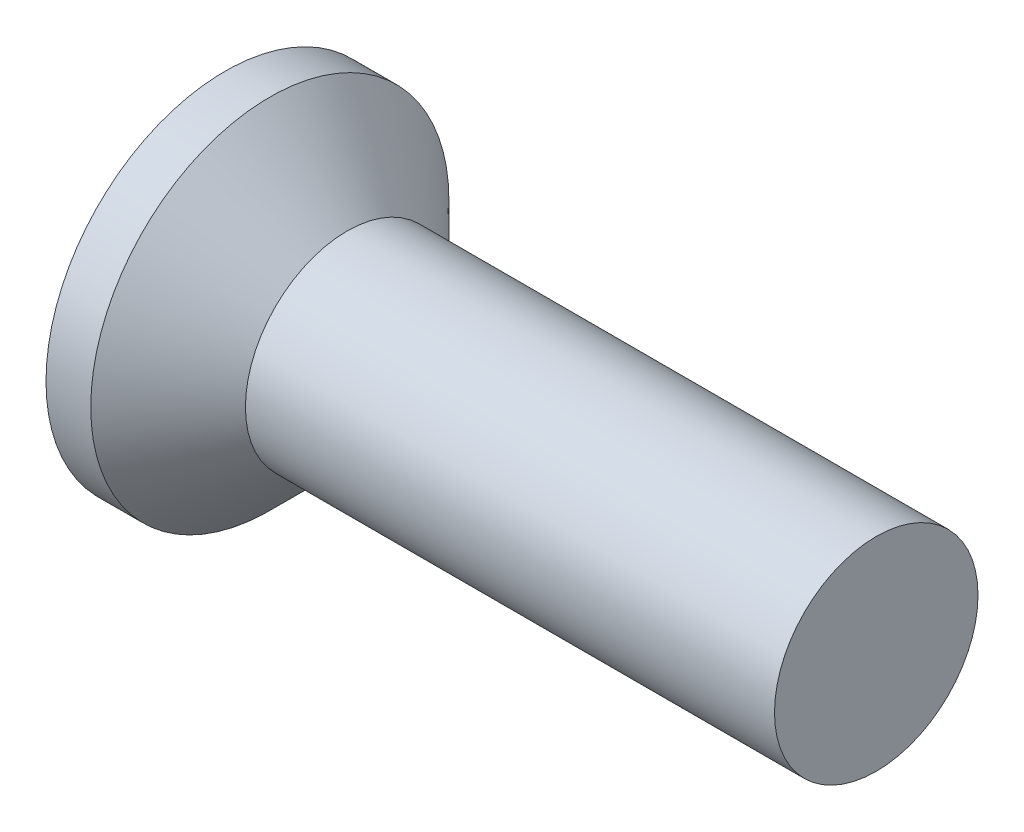
ISO-10303-21;
HEADER;
FILE_DESCRIPTION(('STEP AP214'),'2;1');
FILE_NAME('part.step','',(''),(''),'','','');
FILE_SCHEMA(('AUTOMOTIVE_DESIGN { 1 0 10303 214 1 1 1 1 }'));
ENDSEC;
DATA;
#1=APPLICATION_CONTEXT('core data for automotive mechanical design processes');
#2=APPLICATION_PROTOCOL_DEFINITION('international standard','automotive_design',2000,#1);
#3=PRODUCT_CONTEXT('',#1,'mechanical');
#4=PRODUCT('Part','Part','',(#3));
#5=PRODUCT_RELATED_PRODUCT_CATEGORY('part','',(#4));
#6=PRODUCT_DEFINITION_FORMATION('','',#4);
#7=PRODUCT_DEFINITION_CONTEXT('part definition',#1,'design');
#8=PRODUCT_DEFINITION('design','',#6,#7);
#9=PRODUCT_DEFINITION_SHAPE('','',#8);
#10=(LENGTH_UNIT() NAMED_UNIT(*) SI_UNIT(.MILLI.,.METRE.));
#11=(NAMED_UNIT(*) PLANE_ANGLE_UNIT() SI_UNIT($,.RADIAN.));
#12=(NAMED_UNIT(*) SI_UNIT($,.STERADIAN.) SOLID_ANGLE_UNIT());
#13=UNCERTAINTY_MEASURE_WITH_UNIT(LENGTH_MEASURE(1.E-05),#10,'distance_accuracy_value','');
#14=(GEOMETRIC_REPRESENTATION_CONTEXT(3) GLOBAL_UNCERTAINTY_ASSIGNED_CONTEXT((#13)) GLOBAL_UNIT_ASSIGNED_CONTEXT((#10,
#11,#12)) REPRESENTATION_CONTEXT('',''));
#15=CARTESIAN_POINT('',(0.,0.,0.));
#16=DIRECTION('',(0.,0.,1.));
#17=DIRECTION('',(1.,0.,0.));
#18=AXIS2_PLACEMENT_3D('',#15,#16,#17);
#19=CARTESIAN_POINT('',(0.,2.2,0.));
#20=DIRECTION('',(-1.,0.,0.));
#21=DIRECTION('',(0.,0.,1.));
#22=AXIS2_PLACEMENT_3D('',#19,#20,#21);
#23=PLANE('',#22);
#24=CARTESIAN_POINT('',(0.,0.,0.));
#25=DIRECTION('',(1.,0.,0.));
#26=DIRECTION('',(0.,0.,-1.));
#27=AXIS2_PLACEMENT_3D('',#24,#25,#26);
#28=CIRCLE('',#27,2.2);
#29=CARTESIAN_POINT('',(0.,0.,-2.2));
#30=VERTEX_POINT('',#29);
#31=EDGE_CURVE('E182',#30,#30,#28,.T.);
#32=ORIENTED_EDGE('',*,*,#31,.F.);
#33=EDGE_LOOP('',(#32));
#34=FACE_BOUND('',#33,.T.);
#35=DIRECTION('',(0.,1.,0.));
#36=VECTOR('',#35,1.);
#37=CARTESIAN_POINT('',(0.,-0.29,-0.29));
#38=LINE('',#37,#36);
#39=CARTESIAN_POINT('',(0.,-1.45,-0.29));
#40=VERTEX_POINT('',#39);
#41=CARTESIAN_POINT('',(0.,-0.59,-0.29));
#42=VERTEX_POINT('',#41);
#43=EDGE_CURVE('E308',#40,#42,#38,.T.);
#44=ORIENTED_EDGE('',*,*,#43,.T.);
#45=CARTESIAN_POINT('',(0.,-0.59,-0.59));
#46=DIRECTION('',(-1.,0.,0.));
#47=DIRECTION('',(0.,0.,1.));
#48=AXIS2_PLACEMENT_3D('',#45,#46,#47);
#49=CIRCLE('',#48,0.3);
#50=CARTESIAN_POINT('',(0.,-0.29,-0.59));
#51=VERTEX_POINT('',#50);
#52=EDGE_CURVE('E187',#42,#51,#49,.T.);
#53=ORIENTED_EDGE('',*,*,#52,.T.);
#54=DIRECTION('',(0.,0.,-1.));
#55=VECTOR('',#54,1.);
#56=CARTESIAN_POINT('',(0.,-0.29,-0.29));
#57=LINE('',#56,#55);
#58=CARTESIAN_POINT('',(0.,-0.29,-1.45));
#59=VERTEX_POINT('',#58);
#60=EDGE_CURVE('E310',#51,#59,#57,.T.);
#61=ORIENTED_EDGE('',*,*,#60,.T.);
#62=DIRECTION('',(0.,1.,0.));
#63=VECTOR('',#62,1.);
#64=CARTESIAN_POINT('',(0.,0.29,-1.45));
#65=LINE('',#64,#63);
#66=CARTESIAN_POINT('',(0.,0.29,-1.45));
#67=VERTEX_POINT('',#66);
#68=EDGE_CURVE('E312',#59,#67,#65,.T.);
#69=ORIENTED_EDGE('',*,*,#68,.T.);
#70=DIRECTION('',(0.,0.,1.));
#71=VECTOR('',#70,1.);
#72=CARTESIAN_POINT('',(0.,0.29,-0.29));
#73=LINE('',#72,#71);
#74=CARTESIAN_POINT('',(0.,0.29,-0.59));
#75=VERTEX_POINT('',#74);
#76=EDGE_CURVE('E315',#67,#75,#73,.T.);
#77=ORIENTED_EDGE('',*,*,#76,.T.);
#78=CARTESIAN_POINT('',(0.,0.59,-0.59));
#79=DIRECTION('',(-1.,0.,0.));
#80=DIRECTION('',(0.,0.,1.));
#81=AXIS2_PLACEMENT_3D('',#78,#79,#80);
#82=CIRCLE('',#81,0.3);
#83=CARTESIAN_POINT('',(0.,0.59,-0.29));
#84=VERTEX_POINT('',#83);
#85=EDGE_CURVE('E185',#75,#84,#82,.T.);
#86=ORIENTED_EDGE('',*,*,#85,.T.);
#87=DIRECTION('',(0.,1.,0.));
#88=VECTOR('',#87,1.);
#89=CARTESIAN_POINT('',(0.,0.29,-0.29));
#90=LINE('',#89,#88);
#91=CARTESIAN_POINT('',(0.,1.45,-0.29));
#92=VERTEX_POINT('',#91);
#93=EDGE_CURVE('E318',#84,#92,#90,.T.);
#94=ORIENTED_EDGE('',*,*,#93,.T.);
#95=DIRECTION('',(0.,0.,1.));
#96=VECTOR('',#95,1.);
#97=CARTESIAN_POINT('',(0.,1.45,-0.29));
#98=LINE('',#97,#96);
#99=CARTESIAN_POINT('',(0.,1.45,0.29));
#100=VERTEX_POINT('',#99);
#101=EDGE_CURVE('E320',#92,#100,#98,.T.);
#102=ORIENTED_EDGE('',*,*,#101,.T.);
#103=DIRECTION('',(0.,-1.,0.));
#104=VECTOR('',#103,1.);
#105=CARTESIAN_POINT('',(0.,0.29,0.29));
#106=LINE('',#105,#104);
#107=CARTESIAN_POINT('',(0.,0.59,0.29));
#108=VERTEX_POINT('',#107);
#109=EDGE_CURVE('E323',#100,#108,#106,.T.);
#110=ORIENTED_EDGE('',*,*,#109,.T.);
#111=CARTESIAN_POINT('',(0.,0.59,0.59));
#112=DIRECTION('',(-1.,0.,0.));
#113=DIRECTION('',(0.,0.,1.));
#114=AXIS2_PLACEMENT_3D('',#111,#112,#113);
#115=CIRCLE('',#114,0.3);
#116=CARTESIAN_POINT('',(0.,0.29,0.59));
#117=VERTEX_POINT('',#116);
#118=EDGE_CURVE('E150',#108,#117,#115,.T.);
#119=ORIENTED_EDGE('',*,*,#118,.T.);
#120=DIRECTION('',(0.,0.,1.));
#121=VECTOR('',#120,1.);
#122=CARTESIAN_POINT('',(0.,0.29,0.29));
#123=LINE('',#122,#121);
#124=CARTESIAN_POINT('',(0.,0.29,1.45));
#125=VERTEX_POINT('',#124);
#126=EDGE_CURVE('E144',#117,#125,#123,.T.);
#127=ORIENTED_EDGE('',*,*,#126,.T.);
#128=DIRECTION('',(0.,-1.,0.));
#129=VECTOR('',#128,1.);
#130=CARTESIAN_POINT('',(0.,0.29,1.45));
#131=LINE('',#130,#129);
#132=CARTESIAN_POINT('',(0.,-0.29,1.45));
#133=VERTEX_POINT('',#132);
#134=EDGE_CURVE('E148',#125,#133,#131,.T.);
#135=ORIENTED_EDGE('',*,*,#134,.T.);
#136=DIRECTION('',(0.,0.,-1.));
#137=VECTOR('',#136,1.);
#138=CARTESIAN_POINT('',(0.,-0.29,0.29));
#139=LINE('',#138,#137);
#140=CARTESIAN_POINT('',(0.,-0.29,0.59));
#141=VERTEX_POINT('',#140);
#142=EDGE_CURVE('E162',#133,#141,#139,.T.);
#143=ORIENTED_EDGE('',*,*,#142,.T.);
#144=CARTESIAN_POINT('',(0.,-0.59,0.59));
#145=DIRECTION('',(-1.,0.,0.));
#146=DIRECTION('',(0.,0.,1.));
#147=AXIS2_PLACEMENT_3D('',#144,#145,#146);
#148=CIRCLE('',#147,0.3);
#149=CARTESIAN_POINT('',(0.,-0.59,0.29));
#150=VERTEX_POINT('',#149);
#151=EDGE_CURVE('E181',#141,#150,#148,.T.);
#152=ORIENTED_EDGE('',*,*,#151,.T.);
#153=DIRECTION('',(0.,-1.,0.));
#154=VECTOR('',#153,1.);
#155=CARTESIAN_POINT('',(0.,-0.29,0.29));
#156=LINE('',#155,#154);
#157=CARTESIAN_POINT('',(0.,-1.45,0.289999999999999));
#158=VERTEX_POINT('',#157);
#159=EDGE_CURVE('E303',#150,#158,#156,.T.);
#160=ORIENTED_EDGE('',*,*,#159,.T.);
#161=DIRECTION('',(0.,0.,-1.));
#162=VECTOR('',#161,1.);
#163=CARTESIAN_POINT('',(0.,-1.45,-0.29));
#164=LINE('',#163,#162);
#165=EDGE_CURVE('E305',#158,#40,#164,.T.);
#166=ORIENTED_EDGE('',*,*,#165,.T.);
#167=EDGE_LOOP('',(#44,#53,#61,#69,#77,#86,#94,#102,#110,#119,#127,#135,#143,#152,#160,#166));
#168=FACE_BOUND('',#167,.T.);
#169=ADVANCED_FACE('F31',(#34,#168),#23,.T.);
#170=CARTESIAN_POINT('',(8.,1.25,0.));
#171=DIRECTION('',(1.,0.,0.));
#172=DIRECTION('',(0.,0.,-1.));
#173=AXIS2_PLACEMENT_3D('',#170,#171,#172);
#174=PLANE('',#173);
#175=CARTESIAN_POINT('',(8.,0.,0.));
#176=DIRECTION('',(1.,0.,0.));
#177=DIRECTION('',(0.,0.,-1.));
#178=AXIS2_PLACEMENT_3D('',#175,#176,#177);
#179=CIRCLE('',#178,1.25);
#180=CARTESIAN_POINT('',(8.,0.,-1.25));
#181=VERTEX_POINT('',#180);
#182=EDGE_CURVE('E168',#181,#181,#179,.T.);
#183=ORIENTED_EDGE('',*,*,#182,.T.);
#184=EDGE_LOOP('',(#183));
#185=FACE_BOUND('',#184,.T.);
#186=ADVANCED_FACE('F235',(#185),#174,.T.);
#187=CARTESIAN_POINT('',(4.51581291088132,0.,0.));
#188=DIRECTION('',(1.,0.,0.));
#189=DIRECTION('',(0.,0.,-1.));
#190=AXIS2_PLACEMENT_3D('',#187,#188,#189);
#191=CYLINDRICAL_SURFACE('',#190,2.2);
#192=ORIENTED_EDGE('',*,*,#31,.T.);
#193=EDGE_LOOP('',(#192));
#194=FACE_BOUND('',#193,.T.);
#195=CARTESIAN_POINT('',(0.550000000000004,0.,0.));
#196=DIRECTION('',(1.,0.,0.));
#197=DIRECTION('',(0.,0.,-1.));
#198=AXIS2_PLACEMENT_3D('',#195,#196,#197);
#199=CIRCLE('',#198,2.2);
#200=CARTESIAN_POINT('',(0.550000000000004,0.,-2.2));
#201=VERTEX_POINT('',#200);
#202=EDGE_CURVE('E327',#201,#201,#199,.T.);
#203=ORIENTED_EDGE('',*,*,#202,.F.);
#204=EDGE_LOOP('',(#203));
#205=FACE_BOUND('',#204,.T.);
#206=ADVANCED_FACE('F241',(#194,#205),#191,.T.);
#207=CARTESIAN_POINT('',(1.5,0.,0.));
#208=DIRECTION('',(-1.,0.,0.));
#209=DIRECTION('',(0.,0.,1.));
#210=AXIS2_PLACEMENT_3D('',#207,#208,#209);
#211=CONICAL_SURFACE('',#210,1.25,0.78539816339745);
#212=ORIENTED_EDGE('',*,*,#202,.T.);
#213=EDGE_LOOP('',(#212));
#214=FACE_BOUND('',#213,.T.);
#215=CARTESIAN_POINT('',(1.5,0.,0.));
#216=DIRECTION('',(1.,0.,0.));
#217=DIRECTION('',(0.,0.,-1.));
#218=AXIS2_PLACEMENT_3D('',#215,#216,#217);
#219=CIRCLE('',#218,1.25);
#220=CARTESIAN_POINT('',(1.5,0.,-1.25));
#221=VERTEX_POINT('',#220);
#222=EDGE_CURVE('E171',#221,#221,#219,.T.);
#223=ORIENTED_EDGE('',*,*,#222,.F.);
#224=EDGE_LOOP('',(#223));
#225=FACE_BOUND('',#224,.T.);
#226=ADVANCED_FACE('F363',(#214,#225),#211,.T.);
#227=CARTESIAN_POINT('',(4.51581291088132,0.,0.));
#228=DIRECTION('',(1.,0.,0.));
#229=DIRECTION('',(0.,0.,-1.));
#230=AXIS2_PLACEMENT_3D('',#227,#228,#229);
#231=CYLINDRICAL_SURFACE('',#230,1.25);
#232=ORIENTED_EDGE('',*,*,#222,.T.);
#233=EDGE_LOOP('',(#232));
#234=FACE_BOUND('',#233,.T.);
#235=ORIENTED_EDGE('',*,*,#182,.F.);
#236=EDGE_LOOP('',(#235));
#237=FACE_BOUND('',#236,.T.);
#238=ADVANCED_FACE('F361',(#234,#237),#231,.T.);
#239=CARTESIAN_POINT('',(0.75,0.29,0.29));
#240=DIRECTION('',(0.,-1.,0.));
#241=DIRECTION('',(0.,0.,-1.));
#242=AXIS2_PLACEMENT_3D('',#239,#240,#241);
#243=PLANE('',#242);
#244=ORIENTED_EDGE('',*,*,#126,.F.);
#245=DIRECTION('',(-1.,0.,0.));
#246=VECTOR('',#245,1.);
#247=CARTESIAN_POINT('',(0.75,0.29,0.59));
#248=LINE('',#247,#246);
#249=CARTESIAN_POINT('',(0.75,0.29,0.59));
#250=VERTEX_POINT('',#249);
#251=EDGE_CURVE('E199',#117,#250,#248,.F.);
#252=ORIENTED_EDGE('',*,*,#251,.T.);
#253=DIRECTION('',(0.,0.,1.));
#254=VECTOR('',#253,1.);
#255=CARTESIAN_POINT('',(0.75,0.29,0.29));
#256=LINE('',#255,#254);
#257=CARTESIAN_POINT('',(0.75,0.29,1.01698729810778));
#258=VERTEX_POINT('',#257);
#259=EDGE_CURVE('E166',#250,#258,#256,.T.);
#260=ORIENTED_EDGE('',*,*,#259,.T.);
#261=DIRECTION('',(-0.866025403784438,0.,0.500000000000001));
#262=VECTOR('',#261,1.);
#263=CARTESIAN_POINT('',(0.,0.29,1.45));
#264=LINE('',#263,#262);
#265=EDGE_CURVE('E158',#258,#125,#264,.T.);
#266=ORIENTED_EDGE('',*,*,#265,.T.);
#267=EDGE_LOOP('',(#244,#252,#260,#266));
#268=FACE_BOUND('',#267,.T.);
#269=ADVANCED_FACE('F164',(#268),#243,.T.);
#270=CARTESIAN_POINT('',(0.,0.29,1.45));
#271=DIRECTION('',(-0.500000000000001,0.,-0.866025403784438));
#272=DIRECTION('',(-0.866025403784438,0.,0.500000000000001));
#273=AXIS2_PLACEMENT_3D('',#270,#271,#272);
#274=PLANE('',#273);
#275=ORIENTED_EDGE('',*,*,#134,.F.);
#276=ORIENTED_EDGE('',*,*,#265,.F.);
#277=DIRECTION('',(0.,-1.,0.));
#278=VECTOR('',#277,1.);
#279=CARTESIAN_POINT('',(0.75,0.29,1.01698729810778));
#280=LINE('',#279,#278);
#281=CARTESIAN_POINT('',(0.75,-0.29,1.01698729810778));
#282=VERTEX_POINT('',#281);
#283=EDGE_CURVE('E177',#258,#282,#280,.T.);
#284=ORIENTED_EDGE('',*,*,#283,.T.);
#285=DIRECTION('',(-0.866025403784438,0.,0.500000000000001));
#286=VECTOR('',#285,1.);
#287=CARTESIAN_POINT('',(1.06479473419497,-0.29,0.835240473580834));
#288=LINE('',#287,#286);
#289=EDGE_CURVE('E160',#282,#133,#288,.T.);
#290=ORIENTED_EDGE('',*,*,#289,.T.);
#291=EDGE_LOOP('',(#275,#276,#284,#290));
#292=FACE_BOUND('',#291,.T.);
#293=ADVANCED_FACE('F157',(#292),#274,.T.);
#294=CARTESIAN_POINT('',(0.75,-0.29,0.29));
#295=DIRECTION('',(0.,1.,0.));
#296=DIRECTION('',(0.,0.,1.));
#297=AXIS2_PLACEMENT_3D('',#294,#295,#296);
#298=PLANE('',#297);
#299=DIRECTION('',(0.,0.,-1.));
#300=VECTOR('',#299,1.);
#301=CARTESIAN_POINT('',(0.75,-0.29,0.29));
#302=LINE('',#301,#300);
#303=CARTESIAN_POINT('',(0.75,-0.29,0.59));
#304=VERTEX_POINT('',#303);
#305=EDGE_CURVE('E349',#282,#304,#302,.T.);
#306=ORIENTED_EDGE('',*,*,#305,.T.);
#307=DIRECTION('',(-1.,0.,0.));
#308=VECTOR('',#307,1.);
#309=CARTESIAN_POINT('',(0.75,-0.29,0.59));
#310=LINE('',#309,#308);
#311=EDGE_CURVE('E201',#304,#141,#310,.T.);
#312=ORIENTED_EDGE('',*,*,#311,.T.);
#313=ORIENTED_EDGE('',*,*,#142,.F.);
#314=ORIENTED_EDGE('',*,*,#289,.F.);
#315=EDGE_LOOP('',(#306,#312,#313,#314));
#316=FACE_BOUND('',#315,.T.);
#317=ADVANCED_FACE('F255',(#316),#298,.T.);
#318=CARTESIAN_POINT('',(0.75,-0.29,0.29));
#319=DIRECTION('',(0.,0.,-1.));
#320=DIRECTION('',(0.,1.,0.));
#321=AXIS2_PLACEMENT_3D('',#318,#319,#320);
#322=PLANE('',#321);
#323=ORIENTED_EDGE('',*,*,#159,.F.);
#324=DIRECTION('',(-1.,0.,0.));
#325=VECTOR('',#324,1.);
#326=CARTESIAN_POINT('',(0.75,-0.59,0.29));
#327=LINE('',#326,#325);
#328=CARTESIAN_POINT('',(0.75,-0.59,0.29));
#329=VERTEX_POINT('',#328);
#330=EDGE_CURVE('E46',#150,#329,#327,.F.);
#331=ORIENTED_EDGE('',*,*,#330,.T.);
#332=DIRECTION('',(0.,-1.,0.));
#333=VECTOR('',#332,1.);
#334=CARTESIAN_POINT('',(0.75,-0.29,0.29));
#335=LINE('',#334,#333);
#336=CARTESIAN_POINT('',(0.75,-1.01698729810778,0.29));
#337=VERTEX_POINT('',#336);
#338=EDGE_CURVE('E292',#329,#337,#335,.T.);
#339=ORIENTED_EDGE('',*,*,#338,.T.);
#340=DIRECTION('',(-0.866025403784438,-0.500000000000001,0.));
#341=VECTOR('',#340,1.);
#342=CARTESIAN_POINT('',(0.,-1.45,0.289999999999999));
#343=LINE('',#342,#341);
#344=EDGE_CURVE('E173',#337,#158,#343,.T.);
#345=ORIENTED_EDGE('',*,*,#344,.T.);
#346=EDGE_LOOP('',(#323,#331,#339,#345));
#347=FACE_BOUND('',#346,.T.);
#348=ADVANCED_FACE('F260',(#347),#322,.T.);
#349=CARTESIAN_POINT('',(0.,-1.45,-0.29));
#350=DIRECTION('',(-0.500000000000001,0.866025403784438,0.));
#351=DIRECTION('',(-0.866025403784438,-0.500000000000001,0.));
#352=AXIS2_PLACEMENT_3D('',#349,#350,#351);
#353=PLANE('',#352);
#354=ORIENTED_EDGE('',*,*,#165,.F.);
#355=ORIENTED_EDGE('',*,*,#344,.F.);
#356=DIRECTION('',(0.,0.,-1.));
#357=VECTOR('',#356,1.);
#358=CARTESIAN_POINT('',(0.75,-1.01698729810778,-0.29));
#359=LINE('',#358,#357);
#360=CARTESIAN_POINT('',(0.75,-1.01698729810778,-0.29));
#361=VERTEX_POINT('',#360);
#362=EDGE_CURVE('E288',#337,#361,#359,.T.);
#363=ORIENTED_EDGE('',*,*,#362,.T.);
#364=DIRECTION('',(-0.866025403784438,-0.500000000000001,0.));
#365=VECTOR('',#364,1.);
#366=CARTESIAN_POINT('',(1.06479473419497,-0.835240473580834,-0.29));
#367=LINE('',#366,#365);
#368=EDGE_CURVE('E287',#361,#40,#367,.T.);
#369=ORIENTED_EDGE('',*,*,#368,.T.);
#370=EDGE_LOOP('',(#354,#355,#363,#369));
#371=FACE_BOUND('',#370,.T.);
#372=ADVANCED_FACE('F256',(#371),#353,.T.);
#373=CARTESIAN_POINT('',(0.75,-0.29,-0.29));
#374=DIRECTION('',(0.,0.,1.));
#375=DIRECTION('',(1.,0.,0.));
#376=AXIS2_PLACEMENT_3D('',#373,#374,#375);
#377=PLANE('',#376);
#378=DIRECTION('',(0.,1.,0.));
#379=VECTOR('',#378,1.);
#380=CARTESIAN_POINT('',(0.75,-0.29,-0.29));
#381=LINE('',#380,#379);
#382=CARTESIAN_POINT('',(0.75,-0.59,-0.29));
#383=VERTEX_POINT('',#382);
#384=EDGE_CURVE('E281',#361,#383,#381,.T.);
#385=ORIENTED_EDGE('',*,*,#384,.T.);
#386=DIRECTION('',(-1.,0.,0.));
#387=VECTOR('',#386,1.);
#388=CARTESIAN_POINT('',(0.75,-0.59,-0.29));
#389=LINE('',#388,#387);
#390=EDGE_CURVE('E178',#383,#42,#389,.T.);
#391=ORIENTED_EDGE('',*,*,#390,.T.);
#392=ORIENTED_EDGE('',*,*,#43,.F.);
#393=ORIENTED_EDGE('',*,*,#368,.F.);
#394=EDGE_LOOP('',(#385,#391,#392,#393));
#395=FACE_BOUND('',#394,.T.);
#396=ADVANCED_FACE('F259',(#395),#377,.T.);
#397=CARTESIAN_POINT('',(0.75,-0.29,-0.29));
#398=DIRECTION('',(0.,1.,0.));
#399=DIRECTION('',(0.,0.,1.));
#400=AXIS2_PLACEMENT_3D('',#397,#398,#399);
#401=PLANE('',#400);
#402=ORIENTED_EDGE('',*,*,#60,.F.);
#403=DIRECTION('',(-1.,0.,0.));
#404=VECTOR('',#403,1.);
#405=CARTESIAN_POINT('',(0.75,-0.29,-0.59));
#406=LINE('',#405,#404);
#407=CARTESIAN_POINT('',(0.75,-0.29,-0.59));
#408=VERTEX_POINT('',#407);
#409=EDGE_CURVE('E189',#51,#408,#406,.F.);
#410=ORIENTED_EDGE('',*,*,#409,.T.);
#411=DIRECTION('',(0.,0.,-1.));
#412=VECTOR('',#411,1.);
#413=CARTESIAN_POINT('',(0.75,-0.29,-0.29));
#414=LINE('',#413,#412);
#415=CARTESIAN_POINT('',(0.75,-0.29,-1.01698729810778));
#416=VERTEX_POINT('',#415);
#417=EDGE_CURVE('E283',#408,#416,#414,.T.);
#418=ORIENTED_EDGE('',*,*,#417,.T.);
#419=DIRECTION('',(-0.866025403784438,0.,-0.500000000000001));
#420=VECTOR('',#419,1.);
#421=CARTESIAN_POINT('',(0.,-0.29,-1.45));
#422=LINE('',#421,#420);
#423=EDGE_CURVE('E339',#416,#59,#422,.T.);
#424=ORIENTED_EDGE('',*,*,#423,.T.);
#425=EDGE_LOOP('',(#402,#410,#418,#424));
#426=FACE_BOUND('',#425,.T.);
#427=ADVANCED_FACE('F266',(#426),#401,.T.);
#428=CARTESIAN_POINT('',(0.,0.29,-1.45));
#429=DIRECTION('',(-0.500000000000001,0.,0.866025403784438));
#430=DIRECTION('',(0.866025403784438,0.,0.500000000000001));
#431=AXIS2_PLACEMENT_3D('',#428,#429,#430);
#432=PLANE('',#431);
#433=ORIENTED_EDGE('',*,*,#68,.F.);
#434=ORIENTED_EDGE('',*,*,#423,.F.);
#435=DIRECTION('',(0.,1.,0.));
#436=VECTOR('',#435,1.);
#437=CARTESIAN_POINT('',(0.75,0.29,-1.01698729810778));
#438=LINE('',#437,#436);
#439=CARTESIAN_POINT('',(0.75,0.29,-1.01698729810778));
#440=VERTEX_POINT('',#439);
#441=EDGE_CURVE('E290',#416,#440,#438,.T.);
#442=ORIENTED_EDGE('',*,*,#441,.T.);
#443=DIRECTION('',(-0.866025403784438,0.,-0.500000000000001));
#444=VECTOR('',#443,1.);
#445=CARTESIAN_POINT('',(1.06479473419497,0.29,-0.835240473580834));
#446=LINE('',#445,#444);
#447=EDGE_CURVE('E337',#440,#67,#446,.T.);
#448=ORIENTED_EDGE('',*,*,#447,.T.);
#449=EDGE_LOOP('',(#433,#434,#442,#448));
#450=FACE_BOUND('',#449,.T.);
#451=ADVANCED_FACE('F262',(#450),#432,.T.);
#452=CARTESIAN_POINT('',(0.75,0.29,-0.29));
#453=DIRECTION('',(0.,-1.,0.));
#454=DIRECTION('',(0.,0.,-1.));
#455=AXIS2_PLACEMENT_3D('',#452,#453,#454);
#456=PLANE('',#455);
#457=DIRECTION('',(0.,0.,1.));
#458=VECTOR('',#457,1.);
#459=CARTESIAN_POINT('',(0.75,0.29,-0.29));
#460=LINE('',#459,#458);
#461=CARTESIAN_POINT('',(0.75,0.29,-0.59));
#462=VERTEX_POINT('',#461);
#463=EDGE_CURVE('E297',#440,#462,#460,.T.);
#464=ORIENTED_EDGE('',*,*,#463,.T.);
#465=DIRECTION('',(-1.,0.,0.));
#466=VECTOR('',#465,1.);
#467=CARTESIAN_POINT('',(0.75,0.29,-0.59));
#468=LINE('',#467,#466);
#469=EDGE_CURVE('E191',#462,#75,#468,.T.);
#470=ORIENTED_EDGE('',*,*,#469,.T.);
#471=ORIENTED_EDGE('',*,*,#76,.F.);
#472=ORIENTED_EDGE('',*,*,#447,.F.);
#473=EDGE_LOOP('',(#464,#470,#471,#472));
#474=FACE_BOUND('',#473,.T.);
#475=ADVANCED_FACE('F265',(#474),#456,.T.);
#476=CARTESIAN_POINT('',(0.75,0.29,-0.29));
#477=DIRECTION('',(0.,0.,1.));
#478=DIRECTION('',(1.,0.,0.));
#479=AXIS2_PLACEMENT_3D('',#476,#477,#478);
#480=PLANE('',#479);
#481=ORIENTED_EDGE('',*,*,#93,.F.);
#482=DIRECTION('',(-1.,0.,0.));
#483=VECTOR('',#482,1.);
#484=CARTESIAN_POINT('',(0.75,0.59,-0.29));
#485=LINE('',#484,#483);
#486=CARTESIAN_POINT('',(0.75,0.59,-0.29));
#487=VERTEX_POINT('',#486);
#488=EDGE_CURVE('E194',#84,#487,#485,.F.);
#489=ORIENTED_EDGE('',*,*,#488,.T.);
#490=DIRECTION('',(0.,1.,0.));
#491=VECTOR('',#490,1.);
#492=CARTESIAN_POINT('',(0.75,0.29,-0.29));
#493=LINE('',#492,#491);
#494=CARTESIAN_POINT('',(0.75,1.01698729810778,-0.29));
#495=VERTEX_POINT('',#494);
#496=EDGE_CURVE('E300',#487,#495,#493,.T.);
#497=ORIENTED_EDGE('',*,*,#496,.T.);
#498=DIRECTION('',(-0.866025403784438,0.500000000000001,0.));
#499=VECTOR('',#498,1.);
#500=CARTESIAN_POINT('',(0.,1.45,-0.29));
#501=LINE('',#500,#499);
#502=EDGE_CURVE('E333',#495,#92,#501,.T.);
#503=ORIENTED_EDGE('',*,*,#502,.T.);
#504=EDGE_LOOP('',(#481,#489,#497,#503));
#505=FACE_BOUND('',#504,.T.);
#506=ADVANCED_FACE('F251',(#505),#480,.T.);
#507=CARTESIAN_POINT('',(0.,1.45,-0.29));
#508=DIRECTION('',(-0.500000000000001,-0.866025403784438,0.));
#509=DIRECTION('',(0.866025403784438,-0.500000000000001,0.));
#510=AXIS2_PLACEMENT_3D('',#507,#508,#509);
#511=PLANE('',#510);
#512=ORIENTED_EDGE('',*,*,#101,.F.);
#513=ORIENTED_EDGE('',*,*,#502,.F.);
#514=DIRECTION('',(0.,0.,1.));
#515=VECTOR('',#514,1.);
#516=CARTESIAN_POINT('',(0.75,1.01698729810778,-0.29));
#517=LINE('',#516,#515);
#518=CARTESIAN_POINT('',(0.75,1.01698729810778,0.29));
#519=VERTEX_POINT('',#518);
#520=EDGE_CURVE('E221',#495,#519,#517,.T.);
#521=ORIENTED_EDGE('',*,*,#520,.T.);
#522=DIRECTION('',(-0.866025403784438,0.500000000000001,0.));
#523=VECTOR('',#522,1.);
#524=CARTESIAN_POINT('',(1.06479473419497,0.835240473580834,0.29));
#525=LINE('',#524,#523);
#526=EDGE_CURVE('E220',#519,#100,#525,.T.);
#527=ORIENTED_EDGE('',*,*,#526,.T.);
#528=EDGE_LOOP('',(#512,#513,#521,#527));
#529=FACE_BOUND('',#528,.T.);
#530=ADVANCED_FACE('F248',(#529),#511,.T.);
#531=CARTESIAN_POINT('',(0.75,0.29,0.29));
#532=DIRECTION('',(0.,0.,-1.));
#533=DIRECTION('',(0.,1.,0.));
#534=AXIS2_PLACEMENT_3D('',#531,#532,#533);
#535=PLANE('',#534);
#536=DIRECTION('',(0.,-1.,0.));
#537=VECTOR('',#536,1.);
#538=CARTESIAN_POINT('',(0.75,0.29,0.29));
#539=LINE('',#538,#537);
#540=CARTESIAN_POINT('',(0.75,0.59,0.29));
#541=VERTEX_POINT('',#540);
#542=EDGE_CURVE('E213',#519,#541,#539,.T.);
#543=ORIENTED_EDGE('',*,*,#542,.T.);
#544=DIRECTION('',(-1.,0.,0.));
#545=VECTOR('',#544,1.);
#546=CARTESIAN_POINT('',(0.75,0.59,0.29));
#547=LINE('',#546,#545);
#548=EDGE_CURVE('E196',#541,#108,#547,.T.);
#549=ORIENTED_EDGE('',*,*,#548,.T.);
#550=ORIENTED_EDGE('',*,*,#109,.F.);
#551=ORIENTED_EDGE('',*,*,#526,.F.);
#552=EDGE_LOOP('',(#543,#549,#550,#551));
#553=FACE_BOUND('',#552,.T.);
#554=ADVANCED_FACE('F218',(#553),#535,.T.);
#555=CARTESIAN_POINT('',(0.75,0.29,0.29));
#556=DIRECTION('',(1.,0.,0.));
#557=DIRECTION('',(0.,0.,-1.));
#558=AXIS2_PLACEMENT_3D('',#555,#556,#557);
#559=PLANE('',#558);
#560=ORIENTED_EDGE('',*,*,#259,.F.);
#561=CARTESIAN_POINT('',(0.75,0.59,0.59));
#562=DIRECTION('',(1.,0.,0.));
#563=DIRECTION('',(0.,0.,-1.));
#564=AXIS2_PLACEMENT_3D('',#561,#562,#563);
#565=CIRCLE('',#564,0.3);
#566=EDGE_CURVE('E39',#250,#541,#565,.T.);
#567=ORIENTED_EDGE('',*,*,#566,.T.);
#568=ORIENTED_EDGE('',*,*,#542,.F.);
#569=ORIENTED_EDGE('',*,*,#520,.F.);
#570=ORIENTED_EDGE('',*,*,#496,.F.);
#571=CARTESIAN_POINT('',(0.75,0.59,-0.59));
#572=DIRECTION('',(1.,0.,0.));
#573=DIRECTION('',(0.,0.,-1.));
#574=AXIS2_PLACEMENT_3D('',#571,#572,#573);
#575=CIRCLE('',#574,0.3);
#576=EDGE_CURVE('E207',#487,#462,#575,.T.);
#577=ORIENTED_EDGE('',*,*,#576,.T.);
#578=ORIENTED_EDGE('',*,*,#463,.F.);
#579=ORIENTED_EDGE('',*,*,#441,.F.);
#580=ORIENTED_EDGE('',*,*,#417,.F.);
#581=CARTESIAN_POINT('',(0.75,-0.59,-0.59));
#582=DIRECTION('',(1.,0.,0.));
#583=DIRECTION('',(0.,0.,-1.));
#584=AXIS2_PLACEMENT_3D('',#581,#582,#583);
#585=CIRCLE('',#584,0.3);
#586=EDGE_CURVE('E205',#408,#383,#585,.T.);
#587=ORIENTED_EDGE('',*,*,#586,.T.);
#588=ORIENTED_EDGE('',*,*,#384,.F.);
#589=ORIENTED_EDGE('',*,*,#362,.F.);
#590=ORIENTED_EDGE('',*,*,#338,.F.);
#591=CARTESIAN_POINT('',(0.75,-0.59,0.59));
#592=DIRECTION('',(1.,0.,0.));
#593=DIRECTION('',(0.,0.,-1.));
#594=AXIS2_PLACEMENT_3D('',#591,#592,#593);
#595=CIRCLE('',#594,0.3);
#596=EDGE_CURVE('E11',#329,#304,#595,.T.);
#597=ORIENTED_EDGE('',*,*,#596,.T.);
#598=ORIENTED_EDGE('',*,*,#305,.F.);
#599=ORIENTED_EDGE('',*,*,#283,.F.);
#600=EDGE_LOOP('',(#560,#567,#568,#569,#570,#577,#578,#579,#580,#587,#588,#589,#590,#597,#598,#599));
#601=FACE_BOUND('',#600,.T.);
#602=ADVANCED_FACE('F211',(#601),#559,.F.);
#603=CARTESIAN_POINT('',(0.75,-0.59,-0.59));
#604=DIRECTION('',(-1.,0.,0.));
#605=DIRECTION('',(0.,0.,1.));
#606=AXIS2_PLACEMENT_3D('',#603,#604,#605);
#607=CYLINDRICAL_SURFACE('',#606,0.3);
#608=ORIENTED_EDGE('',*,*,#586,.F.);
#609=ORIENTED_EDGE('',*,*,#409,.F.);
#610=ORIENTED_EDGE('',*,*,#52,.F.);
#611=ORIENTED_EDGE('',*,*,#390,.F.);
#612=EDGE_LOOP('',(#608,#609,#610,#611));
#613=FACE_BOUND('',#612,.T.);
#614=ADVANCED_FACE('F231',(#613),#607,.T.);
#615=CARTESIAN_POINT('',(0.75,0.59,-0.59));
#616=DIRECTION('',(-1.,0.,0.));
#617=DIRECTION('',(0.,0.,1.));
#618=AXIS2_PLACEMENT_3D('',#615,#616,#617);
#619=CYLINDRICAL_SURFACE('',#618,0.3);
#620=ORIENTED_EDGE('',*,*,#576,.F.);
#621=ORIENTED_EDGE('',*,*,#488,.F.);
#622=ORIENTED_EDGE('',*,*,#85,.F.);
#623=ORIENTED_EDGE('',*,*,#469,.F.);
#624=EDGE_LOOP('',(#620,#621,#622,#623));
#625=FACE_BOUND('',#624,.T.);
#626=ADVANCED_FACE('F225',(#625),#619,.T.);
#627=CARTESIAN_POINT('',(0.75,0.59,0.59));
#628=DIRECTION('',(-1.,0.,0.));
#629=DIRECTION('',(0.,0.,1.));
#630=AXIS2_PLACEMENT_3D('',#627,#628,#629);
#631=CYLINDRICAL_SURFACE('',#630,0.3);
#632=ORIENTED_EDGE('',*,*,#566,.F.);
#633=ORIENTED_EDGE('',*,*,#251,.F.);
#634=ORIENTED_EDGE('',*,*,#118,.F.);
#635=ORIENTED_EDGE('',*,*,#548,.F.);
#636=EDGE_LOOP('',(#632,#633,#634,#635));
#637=FACE_BOUND('',#636,.T.);
#638=ADVANCED_FACE('F223',(#637),#631,.T.);
#639=CARTESIAN_POINT('',(0.75,-0.59,0.59));
#640=DIRECTION('',(-1.,0.,0.));
#641=DIRECTION('',(0.,0.,1.));
#642=AXIS2_PLACEMENT_3D('',#639,#640,#641);
#643=CYLINDRICAL_SURFACE('',#642,0.3);
#644=ORIENTED_EDGE('',*,*,#596,.F.);
#645=ORIENTED_EDGE('',*,*,#330,.F.);
#646=ORIENTED_EDGE('',*,*,#151,.F.);
#647=ORIENTED_EDGE('',*,*,#311,.F.);
#648=EDGE_LOOP('',(#644,#645,#646,#647));
#649=FACE_BOUND('',#648,.T.);
#650=ADVANCED_FACE('F33',(#649),#643,.T.);
#651=CLOSED_SHELL('',(#169,#186,#206,#226,#238,#269,#293,#317,#348,#372,#396,#427,#451,#475,
#506,#530,#554,#602,#614,#626,#638,#650));
#652=MANIFOLD_SOLID_BREP('B2',#651);
#653=ADVANCED_BREP_SHAPE_REPRESENTATION('',(#18,#652),#14);
#654=SHAPE_DEFINITION_REPRESENTATION(#9,#653);
ENDSEC;
END-ISO-10303-21;
